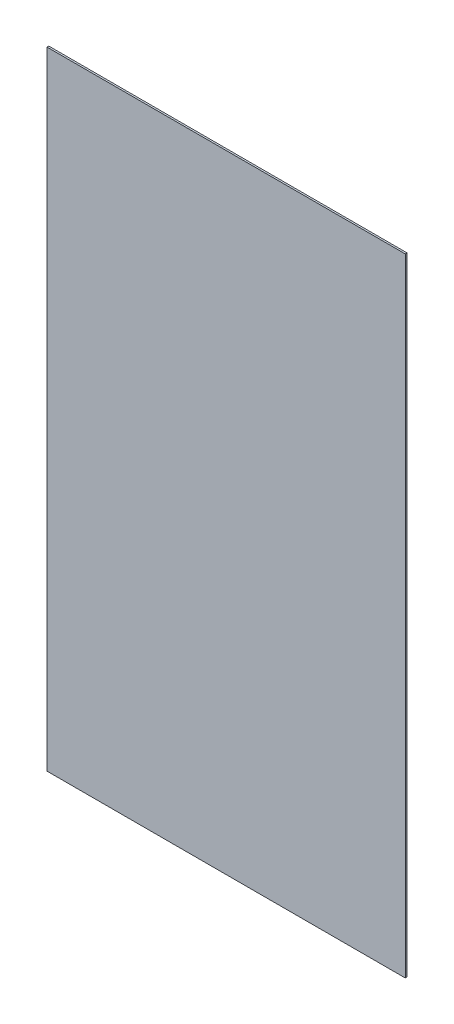
ISO-10303-21;
HEADER;
FILE_DESCRIPTION(('STEP AP214'),'2;1');
FILE_NAME('part.step','',(''),(''),'','','');
FILE_SCHEMA(('AUTOMOTIVE_DESIGN { 1 0 10303 214 1 1 1 1 }'));
ENDSEC;
DATA;
#1=APPLICATION_CONTEXT('core data for automotive mechanical design processes');
#2=APPLICATION_PROTOCOL_DEFINITION('international standard','automotive_design',2000,#1);
#3=PRODUCT_CONTEXT('',#1,'mechanical');
#4=PRODUCT('Part','Part','',(#3));
#5=PRODUCT_RELATED_PRODUCT_CATEGORY('part','',(#4));
#6=PRODUCT_DEFINITION_FORMATION('','',#4);
#7=PRODUCT_DEFINITION_CONTEXT('part definition',#1,'design');
#8=PRODUCT_DEFINITION('design','',#6,#7);
#9=PRODUCT_DEFINITION_SHAPE('','',#8);
#10=(LENGTH_UNIT() NAMED_UNIT(*) SI_UNIT(.MILLI.,.METRE.));
#11=(NAMED_UNIT(*) PLANE_ANGLE_UNIT() SI_UNIT($,.RADIAN.));
#12=(NAMED_UNIT(*) SI_UNIT($,.STERADIAN.) SOLID_ANGLE_UNIT());
#13=UNCERTAINTY_MEASURE_WITH_UNIT(LENGTH_MEASURE(1.E-05),#10,'distance_accuracy_value','');
#14=(GEOMETRIC_REPRESENTATION_CONTEXT(3) GLOBAL_UNCERTAINTY_ASSIGNED_CONTEXT((#13)) GLOBAL_UNIT_ASSIGNED_CONTEXT((#10,
#11,#12)) REPRESENTATION_CONTEXT('',''));
#15=CARTESIAN_POINT('',(0.,0.,0.));
#16=DIRECTION('',(0.,0.,1.));
#17=DIRECTION('',(1.,0.,0.));
#18=AXIS2_PLACEMENT_3D('',#15,#16,#17);
#19=CARTESIAN_POINT('',(254.,-444.5,2.54));
#20=DIRECTION('',(-1.,0.,0.));
#21=DIRECTION('',(0.,0.,1.));
#22=AXIS2_PLACEMENT_3D('',#19,#20,#21);
#23=PLANE('',#22);
#24=DIRECTION('',(0.,1.,0.));
#25=VECTOR('',#24,1.);
#26=CARTESIAN_POINT('',(254.,-444.5,0.));
#27=LINE('',#26,#25);
#28=CARTESIAN_POINT('',(254.,-444.5,0.));
#29=VERTEX_POINT('',#28);
#30=CARTESIAN_POINT('',(254.,444.5,0.));
#31=VERTEX_POINT('',#30);
#32=EDGE_CURVE('E102',#29,#31,#27,.T.);
#33=ORIENTED_EDGE('',*,*,#32,.T.);
#34=DIRECTION('',(0.,0.,-1.));
#35=VECTOR('',#34,1.);
#36=CARTESIAN_POINT('',(254.,444.5,2.54));
#37=LINE('',#36,#35);
#38=CARTESIAN_POINT('',(254.,444.5,2.54));
#39=VERTEX_POINT('',#38);
#40=EDGE_CURVE('E11',#39,#31,#37,.T.);
#41=ORIENTED_EDGE('',*,*,#40,.F.);
#42=DIRECTION('',(0.,1.,0.));
#43=VECTOR('',#42,1.);
#44=CARTESIAN_POINT('',(254.,-444.5,2.54));
#45=LINE('',#44,#43);
#46=CARTESIAN_POINT('',(254.,-444.5,2.54));
#47=VERTEX_POINT('',#46);
#48=EDGE_CURVE('E90',#47,#39,#45,.T.);
#49=ORIENTED_EDGE('',*,*,#48,.F.);
#50=DIRECTION('',(0.,0.,-1.));
#51=VECTOR('',#50,1.);
#52=CARTESIAN_POINT('',(254.,-444.5,2.54));
#53=LINE('',#52,#51);
#54=EDGE_CURVE('E98',#47,#29,#53,.T.);
#55=ORIENTED_EDGE('',*,*,#54,.T.);
#56=EDGE_LOOP('',(#33,#41,#49,#55));
#57=FACE_BOUND('',#56,.T.);
#58=ADVANCED_FACE('F39',(#57),#23,.F.);
#59=CARTESIAN_POINT('',(-254.,444.5,2.54));
#60=DIRECTION('',(0.,-1.,0.));
#61=DIRECTION('',(0.,0.,-1.));
#62=AXIS2_PLACEMENT_3D('',#59,#60,#61);
#63=PLANE('',#62);
#64=DIRECTION('',(-1.,0.,0.));
#65=VECTOR('',#64,1.);
#66=CARTESIAN_POINT('',(-254.,444.5,0.));
#67=LINE('',#66,#65);
#68=CARTESIAN_POINT('',(-254.,444.5,0.));
#69=VERTEX_POINT('',#68);
#70=EDGE_CURVE('E94',#31,#69,#67,.T.);
#71=ORIENTED_EDGE('',*,*,#70,.T.);
#72=DIRECTION('',(0.,0.,-1.));
#73=VECTOR('',#72,1.);
#74=CARTESIAN_POINT('',(-254.,444.5,2.54));
#75=LINE('',#74,#73);
#76=CARTESIAN_POINT('',(-254.,444.5,2.54));
#77=VERTEX_POINT('',#76);
#78=EDGE_CURVE('E47',#77,#69,#75,.T.);
#79=ORIENTED_EDGE('',*,*,#78,.F.);
#80=DIRECTION('',(-1.,0.,0.));
#81=VECTOR('',#80,1.);
#82=CARTESIAN_POINT('',(-254.,444.5,2.54));
#83=LINE('',#82,#81);
#84=EDGE_CURVE('E85',#39,#77,#83,.T.);
#85=ORIENTED_EDGE('',*,*,#84,.F.);
#86=ORIENTED_EDGE('',*,*,#40,.T.);
#87=EDGE_LOOP('',(#71,#79,#85,#86));
#88=FACE_BOUND('',#87,.T.);
#89=ADVANCED_FACE('F93',(#88),#63,.F.);
#90=CARTESIAN_POINT('',(-254.,-444.5,2.54));
#91=DIRECTION('',(1.,0.,0.));
#92=DIRECTION('',(0.,0.,-1.));
#93=AXIS2_PLACEMENT_3D('',#90,#91,#92);
#94=PLANE('',#93);
#95=DIRECTION('',(0.,-1.,0.));
#96=VECTOR('',#95,1.);
#97=CARTESIAN_POINT('',(-254.,-444.5,0.));
#98=LINE('',#97,#96);
#99=CARTESIAN_POINT('',(-254.,-444.5,0.));
#100=VERTEX_POINT('',#99);
#101=EDGE_CURVE('E72',#69,#100,#98,.T.);
#102=ORIENTED_EDGE('',*,*,#101,.T.);
#103=DIRECTION('',(0.,0.,-1.));
#104=VECTOR('',#103,1.);
#105=CARTESIAN_POINT('',(-254.,-444.5,2.54));
#106=LINE('',#105,#104);
#107=CARTESIAN_POINT('',(-254.,-444.5,2.54));
#108=VERTEX_POINT('',#107);
#109=EDGE_CURVE('E95',#108,#100,#106,.T.);
#110=ORIENTED_EDGE('',*,*,#109,.F.);
#111=DIRECTION('',(0.,-1.,0.));
#112=VECTOR('',#111,1.);
#113=CARTESIAN_POINT('',(-254.,-444.5,2.54));
#114=LINE('',#113,#112);
#115=EDGE_CURVE('E88',#77,#108,#114,.T.);
#116=ORIENTED_EDGE('',*,*,#115,.F.);
#117=ORIENTED_EDGE('',*,*,#78,.T.);
#118=EDGE_LOOP('',(#102,#110,#116,#117));
#119=FACE_BOUND('',#118,.T.);
#120=ADVANCED_FACE('F96',(#119),#94,.F.);
#121=CARTESIAN_POINT('',(-254.,-444.5,2.54));
#122=DIRECTION('',(0.,1.,0.));
#123=DIRECTION('',(0.,0.,1.));
#124=AXIS2_PLACEMENT_3D('',#121,#122,#123);
#125=PLANE('',#124);
#126=DIRECTION('',(1.,0.,0.));
#127=VECTOR('',#126,1.);
#128=CARTESIAN_POINT('',(-254.,-444.5,0.));
#129=LINE('',#128,#127);
#130=EDGE_CURVE('E78',#100,#29,#129,.T.);
#131=ORIENTED_EDGE('',*,*,#130,.T.);
#132=ORIENTED_EDGE('',*,*,#54,.F.);
#133=DIRECTION('',(1.,0.,0.));
#134=VECTOR('',#133,1.);
#135=CARTESIAN_POINT('',(-254.,-444.5,2.54));
#136=LINE('',#135,#134);
#137=EDGE_CURVE('E55',#108,#47,#136,.T.);
#138=ORIENTED_EDGE('',*,*,#137,.F.);
#139=ORIENTED_EDGE('',*,*,#109,.T.);
#140=EDGE_LOOP('',(#131,#132,#138,#139));
#141=FACE_BOUND('',#140,.T.);
#142=ADVANCED_FACE('F109',(#141),#125,.F.);
#143=CARTESIAN_POINT('',(0.,0.,2.54));
#144=DIRECTION('',(0.,0.,-1.));
#145=DIRECTION('',(-1.,0.,0.));
#146=AXIS2_PLACEMENT_3D('',#143,#144,#145);
#147=PLANE('',#146);
#148=ORIENTED_EDGE('',*,*,#48,.T.);
#149=ORIENTED_EDGE('',*,*,#84,.T.);
#150=ORIENTED_EDGE('',*,*,#115,.T.);
#151=ORIENTED_EDGE('',*,*,#137,.T.);
#152=EDGE_LOOP('',(#148,#149,#150,#151));
#153=FACE_BOUND('',#152,.T.);
#154=ADVANCED_FACE('F86',(#153),#147,.F.);
#155=CARTESIAN_POINT('',(0.,0.,0.));
#156=DIRECTION('',(0.,0.,-1.));
#157=DIRECTION('',(-1.,0.,0.));
#158=AXIS2_PLACEMENT_3D('',#155,#156,#157);
#159=PLANE('',#158);
#160=ORIENTED_EDGE('',*,*,#32,.F.);
#161=ORIENTED_EDGE('',*,*,#130,.F.);
#162=ORIENTED_EDGE('',*,*,#101,.F.);
#163=ORIENTED_EDGE('',*,*,#70,.F.);
#164=EDGE_LOOP('',(#160,#161,#162,#163));
#165=FACE_BOUND('',#164,.T.);
#166=ADVANCED_FACE('F112',(#165),#159,.T.);
#167=CLOSED_SHELL('',(#58,#89,#120,#142,#154,#166));
#168=MANIFOLD_SOLID_BREP('B2',#167);
#169=ADVANCED_BREP_SHAPE_REPRESENTATION('',(#18,#168),#14);
#170=SHAPE_DEFINITION_REPRESENTATION(#9,#169);
ENDSEC;
END-ISO-10303-21;
